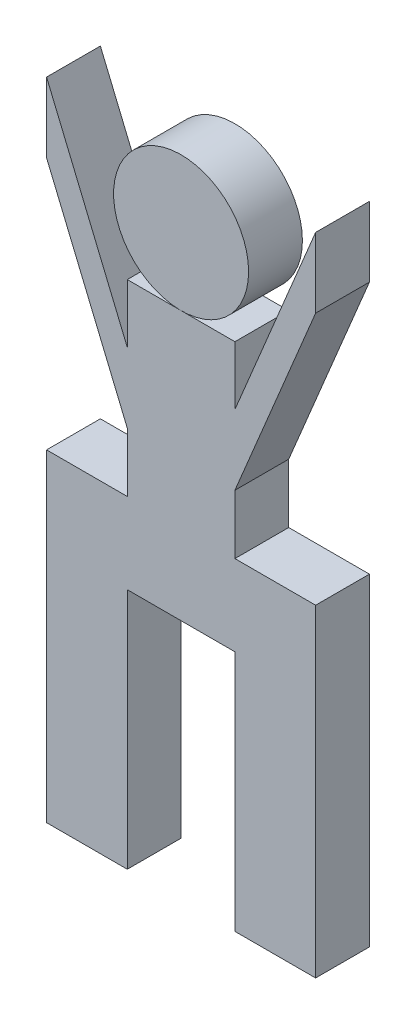
ISO-10303-21;
HEADER;
FILE_DESCRIPTION(('STEP AP214'),'2;1');
FILE_NAME('part.step','',(''),(''),'','','');
FILE_SCHEMA(('AUTOMOTIVE_DESIGN { 1 0 10303 214 1 1 1 1 }'));
ENDSEC;
DATA;
#1=APPLICATION_CONTEXT('core data for automotive mechanical design processes');
#2=APPLICATION_PROTOCOL_DEFINITION('international standard','automotive_design',2000,#1);
#3=PRODUCT_CONTEXT('',#1,'mechanical');
#4=PRODUCT('Part','Part','',(#3));
#5=PRODUCT_RELATED_PRODUCT_CATEGORY('part','',(#4));
#6=PRODUCT_DEFINITION_FORMATION('','',#4);
#7=PRODUCT_DEFINITION_CONTEXT('part definition',#1,'design');
#8=PRODUCT_DEFINITION('design','',#6,#7);
#9=PRODUCT_DEFINITION_SHAPE('','',#8);
#10=(LENGTH_UNIT() NAMED_UNIT(*) SI_UNIT(.MILLI.,.METRE.));
#11=(NAMED_UNIT(*) PLANE_ANGLE_UNIT() SI_UNIT($,.RADIAN.));
#12=(NAMED_UNIT(*) SI_UNIT($,.STERADIAN.) SOLID_ANGLE_UNIT());
#13=UNCERTAINTY_MEASURE_WITH_UNIT(LENGTH_MEASURE(1.E-05),#10,'distance_accuracy_value','');
#14=(GEOMETRIC_REPRESENTATION_CONTEXT(3) GLOBAL_UNCERTAINTY_ASSIGNED_CONTEXT((#13)) GLOBAL_UNIT_ASSIGNED_CONTEXT((#10,
#11,#12)) REPRESENTATION_CONTEXT('',''));
#15=CARTESIAN_POINT('',(0.,0.,0.));
#16=DIRECTION('',(0.,0.,1.));
#17=DIRECTION('',(1.,0.,0.));
#18=AXIS2_PLACEMENT_3D('',#15,#16,#17);
#19=CARTESIAN_POINT('',(4.61538461538456,-1.92307692307691,10.));
#20=DIRECTION('',(0.923076923076923,-0.384615384615385,0.));
#21=DIRECTION('',(0.384615384615386,0.923076923076923,0.));
#22=AXIS2_PLACEMENT_3D('',#19,#20,#21);
#23=PLANE('',#22);
#24=DIRECTION('',(-0.384615384615386,-0.923076923076923,0.));
#25=VECTOR('',#24,1.);
#26=CARTESIAN_POINT('',(4.61538461538456,-1.92307692307691,0.));
#27=LINE('',#26,#25);
#28=CARTESIAN_POINT('',(25.,47.,0.));
#29=VERTEX_POINT('',#28);
#30=CARTESIAN_POINT('',(10.,11.0000000000001,0.));
#31=VERTEX_POINT('',#30);
#32=EDGE_CURVE('E286',#29,#31,#27,.T.);
#33=ORIENTED_EDGE('',*,*,#32,.F.);
#34=DIRECTION('',(0.,0.,-1.));
#35=VECTOR('',#34,1.);
#36=CARTESIAN_POINT('',(25.,47.,10.));
#37=LINE('',#36,#35);
#38=CARTESIAN_POINT('',(25.,47.,10.));
#39=VERTEX_POINT('',#38);
#40=EDGE_CURVE('E13',#39,#29,#37,.T.);
#41=ORIENTED_EDGE('',*,*,#40,.F.);
#42=DIRECTION('',(-0.384615384615386,-0.923076923076923,0.));
#43=VECTOR('',#42,1.);
#44=CARTESIAN_POINT('',(4.61538461538456,-1.92307692307691,10.));
#45=LINE('',#44,#43);
#46=CARTESIAN_POINT('',(10.,11.0000000000001,10.));
#47=VERTEX_POINT('',#46);
#48=EDGE_CURVE('E357',#39,#47,#45,.T.);
#49=ORIENTED_EDGE('',*,*,#48,.T.);
#50=DIRECTION('',(0.,0.,-1.));
#51=VECTOR('',#50,1.);
#52=CARTESIAN_POINT('',(10.,11.0000000000001,10.));
#53=LINE('',#52,#51);
#54=EDGE_CURVE('E203',#47,#31,#53,.T.);
#55=ORIENTED_EDGE('',*,*,#54,.T.);
#56=EDGE_LOOP('',(#33,#41,#49,#55));
#57=FACE_BOUND('',#56,.T.);
#58=ADVANCED_FACE('F116',(#57),#23,.T.);
#59=CARTESIAN_POINT('',(25.0000000000001,0.,10.));
#60=DIRECTION('',(1.,0.,0.));
#61=DIRECTION('',(0.,1.,0.));
#62=AXIS2_PLACEMENT_3D('',#59,#60,#61);
#63=PLANE('',#62);
#64=DIRECTION('',(0.,-1.,0.));
#65=VECTOR('',#64,1.);
#66=CARTESIAN_POINT('',(25.0000000000001,0.,0.));
#67=LINE('',#66,#65);
#68=CARTESIAN_POINT('',(25.,60.,0.));
#69=VERTEX_POINT('',#68);
#70=EDGE_CURVE('E290',#69,#29,#67,.T.);
#71=ORIENTED_EDGE('',*,*,#70,.F.);
#72=DIRECTION('',(0.,0.,-1.));
#73=VECTOR('',#72,1.);
#74=CARTESIAN_POINT('',(25.,60.,10.));
#75=LINE('',#74,#73);
#76=CARTESIAN_POINT('',(25.,60.,10.));
#77=VERTEX_POINT('',#76);
#78=EDGE_CURVE('E125',#77,#69,#75,.T.);
#79=ORIENTED_EDGE('',*,*,#78,.F.);
#80=DIRECTION('',(0.,-1.,0.));
#81=VECTOR('',#80,1.);
#82=CARTESIAN_POINT('',(25.0000000000001,0.,10.));
#83=LINE('',#82,#81);
#84=EDGE_CURVE('E436',#77,#39,#83,.T.);
#85=ORIENTED_EDGE('',*,*,#84,.T.);
#86=ORIENTED_EDGE('',*,*,#40,.T.);
#87=EDGE_LOOP('',(#71,#79,#85,#86));
#88=FACE_BOUND('',#87,.T.);
#89=ADVANCED_FACE('F421',(#88),#63,.T.);
#90=CARTESIAN_POINT('',(0.,0.,10.));
#91=DIRECTION('',(-0.923076923076923,0.384615384615386,0.));
#92=DIRECTION('',(-0.384615384615386,-0.923076923076923,0.));
#93=AXIS2_PLACEMENT_3D('',#90,#91,#92);
#94=PLANE('',#93);
#95=DIRECTION('',(0.384615384615386,0.923076923076923,0.));
#96=VECTOR('',#95,1.);
#97=CARTESIAN_POINT('',(0.,0.,0.));
#98=LINE('',#97,#96);
#99=CARTESIAN_POINT('',(10.,24.0000000000002,0.));
#100=VERTEX_POINT('',#99);
#101=EDGE_CURVE('E294',#100,#69,#98,.T.);
#102=ORIENTED_EDGE('',*,*,#101,.F.);
#103=DIRECTION('',(0.,0.,-1.));
#104=VECTOR('',#103,1.);
#105=CARTESIAN_POINT('',(10.,24.0000000000002,10.));
#106=LINE('',#105,#104);
#107=CARTESIAN_POINT('',(10.,24.0000000000002,10.));
#108=VERTEX_POINT('',#107);
#109=EDGE_CURVE('E408',#108,#100,#106,.T.);
#110=ORIENTED_EDGE('',*,*,#109,.F.);
#111=DIRECTION('',(0.384615384615386,0.923076923076923,0.));
#112=VECTOR('',#111,1.);
#113=CARTESIAN_POINT('',(0.,0.,10.));
#114=LINE('',#113,#112);
#115=EDGE_CURVE('E417',#108,#77,#114,.T.);
#116=ORIENTED_EDGE('',*,*,#115,.T.);
#117=ORIENTED_EDGE('',*,*,#78,.T.);
#118=EDGE_LOOP('',(#102,#110,#116,#117));
#119=FACE_BOUND('',#118,.T.);
#120=ADVANCED_FACE('F415',(#119),#94,.T.);
#121=CARTESIAN_POINT('',(10.0000000000001,0.,10.));
#122=DIRECTION('',(-1.,0.,0.));
#123=DIRECTION('',(0.,-1.,0.));
#124=AXIS2_PLACEMENT_3D('',#121,#122,#123);
#125=PLANE('',#124);
#126=DIRECTION('',(0.,1.,0.));
#127=VECTOR('',#126,1.);
#128=CARTESIAN_POINT('',(10.0000000000001,0.,0.));
#129=LINE('',#128,#127);
#130=CARTESIAN_POINT('',(10.,34.9107304586896,0.));
#131=VERTEX_POINT('',#130);
#132=EDGE_CURVE('E298',#100,#131,#129,.T.);
#133=ORIENTED_EDGE('',*,*,#132,.T.);
#134=DIRECTION('',(0.,0.,-1.));
#135=VECTOR('',#134,1.);
#136=CARTESIAN_POINT('',(10.,34.9107304586896,10.));
#137=LINE('',#136,#135);
#138=CARTESIAN_POINT('',(10.,34.9107304586896,10.));
#139=VERTEX_POINT('',#138);
#140=EDGE_CURVE('E405',#139,#131,#137,.T.);
#141=ORIENTED_EDGE('',*,*,#140,.F.);
#142=DIRECTION('',(0.,1.,0.));
#143=VECTOR('',#142,1.);
#144=CARTESIAN_POINT('',(10.0000000000001,0.,10.));
#145=LINE('',#144,#143);
#146=EDGE_CURVE('E431',#108,#139,#145,.T.);
#147=ORIENTED_EDGE('',*,*,#146,.F.);
#148=ORIENTED_EDGE('',*,*,#109,.T.);
#149=EDGE_LOOP('',(#133,#141,#147,#148));
#150=FACE_BOUND('',#149,.T.);
#151=ADVANCED_FACE('F428',(#150),#125,.F.);
#152=CARTESIAN_POINT('',(0.,34.9107304586896,10.));
#153=DIRECTION('',(0.,1.,0.));
#154=DIRECTION('',(0.,0.,1.));
#155=AXIS2_PLACEMENT_3D('',#152,#153,#154);
#156=PLANE('',#155);
#157=DIRECTION('',(1.,0.,0.));
#158=VECTOR('',#157,1.);
#159=CARTESIAN_POINT('',(0.,34.9107304586896,0.));
#160=LINE('',#159,#158);
#161=CARTESIAN_POINT('',(-10.,34.9107304586896,0.));
#162=VERTEX_POINT('',#161);
#163=EDGE_CURVE('E302',#162,#131,#160,.T.);
#164=ORIENTED_EDGE('',*,*,#163,.F.);
#165=DIRECTION('',(0.,0.,-1.));
#166=VECTOR('',#165,1.);
#167=CARTESIAN_POINT('',(-10.,34.9107304586896,10.));
#168=LINE('',#167,#166);
#169=CARTESIAN_POINT('',(-10.,34.9107304586896,10.));
#170=VERTEX_POINT('',#169);
#171=EDGE_CURVE('E402',#170,#162,#168,.T.);
#172=ORIENTED_EDGE('',*,*,#171,.F.);
#173=DIRECTION('',(1.,0.,0.));
#174=VECTOR('',#173,1.);
#175=CARTESIAN_POINT('',(0.,34.9107304586896,10.));
#176=LINE('',#175,#174);
#177=EDGE_CURVE('E434',#170,#139,#176,.T.);
#178=ORIENTED_EDGE('',*,*,#177,.T.);
#179=ORIENTED_EDGE('',*,*,#140,.T.);
#180=EDGE_LOOP('',(#164,#172,#178,#179));
#181=FACE_BOUND('',#180,.T.);
#182=ADVANCED_FACE('F667',(#181),#156,.T.);
#183=CARTESIAN_POINT('',(-10.0000000000001,0.,10.));
#184=DIRECTION('',(-1.,0.,0.));
#185=DIRECTION('',(0.,-1.,0.));
#186=AXIS2_PLACEMENT_3D('',#183,#184,#185);
#187=PLANE('',#186);
#188=DIRECTION('',(0.,1.,0.));
#189=VECTOR('',#188,1.);
#190=CARTESIAN_POINT('',(-10.0000000000001,0.,0.));
#191=LINE('',#190,#189);
#192=CARTESIAN_POINT('',(-10.,24.0000000000002,0.));
#193=VERTEX_POINT('',#192);
#194=EDGE_CURVE('E306',#193,#162,#191,.T.);
#195=ORIENTED_EDGE('',*,*,#194,.F.);
#196=DIRECTION('',(0.,0.,-1.));
#197=VECTOR('',#196,1.);
#198=CARTESIAN_POINT('',(-10.,24.0000000000002,10.));
#199=LINE('',#198,#197);
#200=CARTESIAN_POINT('',(-10.,24.0000000000002,10.));
#201=VERTEX_POINT('',#200);
#202=EDGE_CURVE('E399',#201,#193,#199,.T.);
#203=ORIENTED_EDGE('',*,*,#202,.F.);
#204=DIRECTION('',(0.,1.,0.));
#205=VECTOR('',#204,1.);
#206=CARTESIAN_POINT('',(-10.0000000000001,0.,10.));
#207=LINE('',#206,#205);
#208=EDGE_CURVE('E445',#201,#170,#207,.T.);
#209=ORIENTED_EDGE('',*,*,#208,.T.);
#210=ORIENTED_EDGE('',*,*,#171,.T.);
#211=EDGE_LOOP('',(#195,#203,#209,#210));
#212=FACE_BOUND('',#211,.T.);
#213=ADVANCED_FACE('F656',(#212),#187,.T.);
#214=CARTESIAN_POINT('',(0.,0.,10.));
#215=DIRECTION('',(-0.923076923076923,-0.384615384615385,0.));
#216=DIRECTION('',(0.384615384615386,-0.923076923076923,0.));
#217=AXIS2_PLACEMENT_3D('',#214,#215,#216);
#218=PLANE('',#217);
#219=DIRECTION('',(-0.384615384615386,0.923076923076923,0.));
#220=VECTOR('',#219,1.);
#221=CARTESIAN_POINT('',(0.,0.,0.));
#222=LINE('',#221,#220);
#223=CARTESIAN_POINT('',(-25.,60.,0.));
#224=VERTEX_POINT('',#223);
#225=EDGE_CURVE('E310',#193,#224,#222,.T.);
#226=ORIENTED_EDGE('',*,*,#225,.T.);
#227=DIRECTION('',(0.,0.,-1.));
#228=VECTOR('',#227,1.);
#229=CARTESIAN_POINT('',(-25.,60.,10.));
#230=LINE('',#229,#228);
#231=CARTESIAN_POINT('',(-25.,60.,10.));
#232=VERTEX_POINT('',#231);
#233=EDGE_CURVE('E395',#232,#224,#230,.T.);
#234=ORIENTED_EDGE('',*,*,#233,.F.);
#235=DIRECTION('',(-0.384615384615386,0.923076923076923,0.));
#236=VECTOR('',#235,1.);
#237=CARTESIAN_POINT('',(0.,0.,10.));
#238=LINE('',#237,#236);
#239=EDGE_CURVE('E449',#201,#232,#238,.T.);
#240=ORIENTED_EDGE('',*,*,#239,.F.);
#241=ORIENTED_EDGE('',*,*,#202,.T.);
#242=EDGE_LOOP('',(#226,#234,#240,#241));
#243=FACE_BOUND('',#242,.T.);
#244=ADVANCED_FACE('F645',(#243),#218,.F.);
#245=CARTESIAN_POINT('',(-25.,0.,10.));
#246=DIRECTION('',(1.,0.,0.));
#247=DIRECTION('',(0.,0.,-1.));
#248=AXIS2_PLACEMENT_3D('',#245,#246,#247);
#249=PLANE('',#248);
#250=DIRECTION('',(0.,-1.,0.));
#251=VECTOR('',#250,1.);
#252=CARTESIAN_POINT('',(-25.,0.,0.));
#253=LINE('',#252,#251);
#254=CARTESIAN_POINT('',(-25.,47.,0.));
#255=VERTEX_POINT('',#254);
#256=EDGE_CURVE('E313',#224,#255,#253,.T.);
#257=ORIENTED_EDGE('',*,*,#256,.T.);
#258=DIRECTION('',(0.,0.,-1.));
#259=VECTOR('',#258,1.);
#260=CARTESIAN_POINT('',(-25.,47.,10.));
#261=LINE('',#260,#259);
#262=CARTESIAN_POINT('',(-25.,47.,10.));
#263=VERTEX_POINT('',#262);
#264=EDGE_CURVE('E391',#263,#255,#261,.T.);
#265=ORIENTED_EDGE('',*,*,#264,.F.);
#266=DIRECTION('',(0.,-1.,0.));
#267=VECTOR('',#266,1.);
#268=CARTESIAN_POINT('',(-25.,0.,10.));
#269=LINE('',#268,#267);
#270=EDGE_CURVE('E452',#232,#263,#269,.T.);
#271=ORIENTED_EDGE('',*,*,#270,.F.);
#272=ORIENTED_EDGE('',*,*,#233,.T.);
#273=EDGE_LOOP('',(#257,#265,#271,#272));
#274=FACE_BOUND('',#273,.T.);
#275=ADVANCED_FACE('F634',(#274),#249,.F.);
#276=CARTESIAN_POINT('',(-4.61538461538456,-1.92307692307691,10.));
#277=DIRECTION('',(0.923076923076923,0.384615384615385,0.));
#278=DIRECTION('',(-0.384615384615386,0.923076923076923,0.));
#279=AXIS2_PLACEMENT_3D('',#276,#277,#278);
#280=PLANE('',#279);
#281=DIRECTION('',(0.384615384615386,-0.923076923076923,0.));
#282=VECTOR('',#281,1.);
#283=CARTESIAN_POINT('',(-4.61538461538456,-1.92307692307691,0.));
#284=LINE('',#283,#282);
#285=CARTESIAN_POINT('',(-10.,11.0000000000001,0.));
#286=VERTEX_POINT('',#285);
#287=EDGE_CURVE('E316',#255,#286,#284,.T.);
#288=ORIENTED_EDGE('',*,*,#287,.T.);
#289=DIRECTION('',(0.,0.,-1.));
#290=VECTOR('',#289,1.);
#291=CARTESIAN_POINT('',(-10.,11.0000000000001,10.));
#292=LINE('',#291,#290);
#293=CARTESIAN_POINT('',(-10.,11.0000000000001,10.));
#294=VERTEX_POINT('',#293);
#295=EDGE_CURVE('E388',#294,#286,#292,.T.);
#296=ORIENTED_EDGE('',*,*,#295,.F.);
#297=DIRECTION('',(0.384615384615386,-0.923076923076923,0.));
#298=VECTOR('',#297,1.);
#299=CARTESIAN_POINT('',(-4.61538461538456,-1.92307692307691,10.));
#300=LINE('',#299,#298);
#301=EDGE_CURVE('E455',#263,#294,#300,.T.);
#302=ORIENTED_EDGE('',*,*,#301,.F.);
#303=ORIENTED_EDGE('',*,*,#264,.T.);
#304=EDGE_LOOP('',(#288,#296,#302,#303));
#305=FACE_BOUND('',#304,.T.);
#306=ADVANCED_FACE('F623',(#305),#280,.F.);
#307=CARTESIAN_POINT('',(-10.,0.,10.));
#308=DIRECTION('',(-1.,0.,0.));
#309=DIRECTION('',(0.,-1.,0.));
#310=AXIS2_PLACEMENT_3D('',#307,#308,#309);
#311=PLANE('',#310);
#312=DIRECTION('',(0.,1.,0.));
#313=VECTOR('',#312,1.);
#314=CARTESIAN_POINT('',(-10.,0.,0.));
#315=LINE('',#314,#313);
#316=CARTESIAN_POINT('',(-10.,0.,0.));
#317=VERTEX_POINT('',#316);
#318=EDGE_CURVE('E320',#317,#286,#315,.T.);
#319=ORIENTED_EDGE('',*,*,#318,.F.);
#320=DIRECTION('',(0.,0.,-1.));
#321=VECTOR('',#320,1.);
#322=CARTESIAN_POINT('',(-10.,0.,10.));
#323=LINE('',#322,#321);
#324=CARTESIAN_POINT('',(-10.,0.,10.));
#325=VERTEX_POINT('',#324);
#326=EDGE_CURVE('E385',#325,#317,#323,.T.);
#327=ORIENTED_EDGE('',*,*,#326,.F.);
#328=DIRECTION('',(0.,1.,0.));
#329=VECTOR('',#328,1.);
#330=CARTESIAN_POINT('',(-10.,0.,10.));
#331=LINE('',#330,#329);
#332=EDGE_CURVE('E458',#325,#294,#331,.T.);
#333=ORIENTED_EDGE('',*,*,#332,.T.);
#334=ORIENTED_EDGE('',*,*,#295,.T.);
#335=EDGE_LOOP('',(#319,#327,#333,#334));
#336=FACE_BOUND('',#335,.T.);
#337=ADVANCED_FACE('F612',(#336),#311,.T.);
#338=CARTESIAN_POINT('',(0.,0.,10.));
#339=DIRECTION('',(0.,1.,0.));
#340=DIRECTION('',(-1.,0.,0.));
#341=AXIS2_PLACEMENT_3D('',#338,#339,#340);
#342=PLANE('',#341);
#343=DIRECTION('',(1.,0.,0.));
#344=VECTOR('',#343,1.);
#345=CARTESIAN_POINT('',(0.,0.,0.));
#346=LINE('',#345,#344);
#347=CARTESIAN_POINT('',(-25.,0.,0.));
#348=VERTEX_POINT('',#347);
#349=EDGE_CURVE('E324',#348,#317,#346,.T.);
#350=ORIENTED_EDGE('',*,*,#349,.F.);
#351=DIRECTION('',(0.,0.,-1.));
#352=VECTOR('',#351,1.);
#353=CARTESIAN_POINT('',(-25.,0.,10.));
#354=LINE('',#353,#352);
#355=CARTESIAN_POINT('',(-25.,0.,10.));
#356=VERTEX_POINT('',#355);
#357=EDGE_CURVE('E382',#356,#348,#354,.T.);
#358=ORIENTED_EDGE('',*,*,#357,.F.);
#359=DIRECTION('',(1.,0.,0.));
#360=VECTOR('',#359,1.);
#361=CARTESIAN_POINT('',(0.,0.,10.));
#362=LINE('',#361,#360);
#363=EDGE_CURVE('E462',#356,#325,#362,.T.);
#364=ORIENTED_EDGE('',*,*,#363,.T.);
#365=ORIENTED_EDGE('',*,*,#326,.T.);
#366=EDGE_LOOP('',(#350,#358,#364,#365));
#367=FACE_BOUND('',#366,.T.);
#368=ADVANCED_FACE('F601',(#367),#342,.T.);
#369=CARTESIAN_POINT('',(-25.,0.,10.));
#370=DIRECTION('',(1.,0.,0.));
#371=DIRECTION('',(0.,1.,0.));
#372=AXIS2_PLACEMENT_3D('',#369,#370,#371);
#373=PLANE('',#372);
#374=DIRECTION('',(0.,-1.,0.));
#375=VECTOR('',#374,1.);
#376=CARTESIAN_POINT('',(-25.,0.,0.));
#377=LINE('',#376,#375);
#378=CARTESIAN_POINT('',(-25.,-60.,0.));
#379=VERTEX_POINT('',#378);
#380=EDGE_CURVE('E328',#348,#379,#377,.T.);
#381=ORIENTED_EDGE('',*,*,#380,.T.);
#382=DIRECTION('',(0.,0.,-1.));
#383=VECTOR('',#382,1.);
#384=CARTESIAN_POINT('',(-25.,-60.,10.));
#385=LINE('',#384,#383);
#386=CARTESIAN_POINT('',(-25.,-60.,10.));
#387=VERTEX_POINT('',#386);
#388=EDGE_CURVE('E378',#387,#379,#385,.T.);
#389=ORIENTED_EDGE('',*,*,#388,.F.);
#390=DIRECTION('',(0.,-1.,0.));
#391=VECTOR('',#390,1.);
#392=CARTESIAN_POINT('',(-25.,0.,10.));
#393=LINE('',#392,#391);
#394=EDGE_CURVE('E466',#356,#387,#393,.T.);
#395=ORIENTED_EDGE('',*,*,#394,.F.);
#396=ORIENTED_EDGE('',*,*,#357,.T.);
#397=EDGE_LOOP('',(#381,#389,#395,#396));
#398=FACE_BOUND('',#397,.T.);
#399=ADVANCED_FACE('F590',(#398),#373,.F.);
#400=CARTESIAN_POINT('',(0.,-60.,10.));
#401=DIRECTION('',(0.,1.,0.));
#402=DIRECTION('',(0.,0.,1.));
#403=AXIS2_PLACEMENT_3D('',#400,#401,#402);
#404=PLANE('',#403);
#405=DIRECTION('',(1.,0.,0.));
#406=VECTOR('',#405,1.);
#407=CARTESIAN_POINT('',(0.,-60.,0.));
#408=LINE('',#407,#406);
#409=CARTESIAN_POINT('',(-10.,-60.,0.));
#410=VERTEX_POINT('',#409);
#411=EDGE_CURVE('E331',#379,#410,#408,.T.);
#412=ORIENTED_EDGE('',*,*,#411,.T.);
#413=DIRECTION('',(0.,0.,-1.));
#414=VECTOR('',#413,1.);
#415=CARTESIAN_POINT('',(-10.,-60.,10.));
#416=LINE('',#415,#414);
#417=CARTESIAN_POINT('',(-10.,-60.,10.));
#418=VERTEX_POINT('',#417);
#419=EDGE_CURVE('E374',#418,#410,#416,.T.);
#420=ORIENTED_EDGE('',*,*,#419,.F.);
#421=DIRECTION('',(1.,0.,0.));
#422=VECTOR('',#421,1.);
#423=CARTESIAN_POINT('',(0.,-60.,10.));
#424=LINE('',#423,#422);
#425=EDGE_CURVE('E469',#387,#418,#424,.T.);
#426=ORIENTED_EDGE('',*,*,#425,.F.);
#427=ORIENTED_EDGE('',*,*,#388,.T.);
#428=EDGE_LOOP('',(#412,#420,#426,#427));
#429=FACE_BOUND('',#428,.T.);
#430=ADVANCED_FACE('F579',(#429),#404,.F.);
#431=CARTESIAN_POINT('',(-10.,0.,10.));
#432=DIRECTION('',(-1.,0.,0.));
#433=DIRECTION('',(0.,0.,1.));
#434=AXIS2_PLACEMENT_3D('',#431,#432,#433);
#435=PLANE('',#434);
#436=DIRECTION('',(0.,1.,0.));
#437=VECTOR('',#436,1.);
#438=CARTESIAN_POINT('',(-10.,0.,0.));
#439=LINE('',#438,#437);
#440=CARTESIAN_POINT('',(-10.,-15.,0.));
#441=VERTEX_POINT('',#440);
#442=EDGE_CURVE('E334',#410,#441,#439,.T.);
#443=ORIENTED_EDGE('',*,*,#442,.T.);
#444=DIRECTION('',(0.,0.,-1.));
#445=VECTOR('',#444,1.);
#446=CARTESIAN_POINT('',(-10.,-15.,10.));
#447=LINE('',#446,#445);
#448=CARTESIAN_POINT('',(-10.,-15.,10.));
#449=VERTEX_POINT('',#448);
#450=EDGE_CURVE('E370',#449,#441,#447,.T.);
#451=ORIENTED_EDGE('',*,*,#450,.F.);
#452=DIRECTION('',(0.,1.,0.));
#453=VECTOR('',#452,1.);
#454=CARTESIAN_POINT('',(-10.,0.,10.));
#455=LINE('',#454,#453);
#456=EDGE_CURVE('E472',#418,#449,#455,.T.);
#457=ORIENTED_EDGE('',*,*,#456,.F.);
#458=ORIENTED_EDGE('',*,*,#419,.T.);
#459=EDGE_LOOP('',(#443,#451,#457,#458));
#460=FACE_BOUND('',#459,.T.);
#461=ADVANCED_FACE('F569',(#460),#435,.F.);
#462=CARTESIAN_POINT('',(0.,-15.,10.));
#463=DIRECTION('',(0.,1.,0.));
#464=DIRECTION('',(-1.,0.,0.));
#465=AXIS2_PLACEMENT_3D('',#462,#463,#464);
#466=PLANE('',#465);
#467=DIRECTION('',(1.,0.,0.));
#468=VECTOR('',#467,1.);
#469=CARTESIAN_POINT('',(0.,-15.,0.));
#470=LINE('',#469,#468);
#471=CARTESIAN_POINT('',(10.,-15.,0.));
#472=VERTEX_POINT('',#471);
#473=EDGE_CURVE('E337',#441,#472,#470,.T.);
#474=ORIENTED_EDGE('',*,*,#473,.T.);
#475=DIRECTION('',(0.,0.,-1.));
#476=VECTOR('',#475,1.);
#477=CARTESIAN_POINT('',(10.,-15.,10.));
#478=LINE('',#477,#476);
#479=CARTESIAN_POINT('',(10.,-15.,10.));
#480=VERTEX_POINT('',#479);
#481=EDGE_CURVE('E367',#480,#472,#478,.T.);
#482=ORIENTED_EDGE('',*,*,#481,.F.);
#483=DIRECTION('',(1.,0.,0.));
#484=VECTOR('',#483,1.);
#485=CARTESIAN_POINT('',(0.,-15.,10.));
#486=LINE('',#485,#484);
#487=EDGE_CURVE('E475',#449,#480,#486,.T.);
#488=ORIENTED_EDGE('',*,*,#487,.F.);
#489=ORIENTED_EDGE('',*,*,#450,.T.);
#490=EDGE_LOOP('',(#474,#482,#488,#489));
#491=FACE_BOUND('',#490,.T.);
#492=ADVANCED_FACE('F490',(#491),#466,.F.);
#493=CARTESIAN_POINT('',(10.,0.,10.));
#494=DIRECTION('',(-1.,0.,0.));
#495=DIRECTION('',(0.,-1.,0.));
#496=AXIS2_PLACEMENT_3D('',#493,#494,#495);
#497=PLANE('',#496);
#498=DIRECTION('',(0.,1.,0.));
#499=VECTOR('',#498,1.);
#500=CARTESIAN_POINT('',(10.,0.,0.));
#501=LINE('',#500,#499);
#502=CARTESIAN_POINT('',(10.,-60.,0.));
#503=VERTEX_POINT('',#502);
#504=EDGE_CURVE('E341',#503,#472,#501,.T.);
#505=ORIENTED_EDGE('',*,*,#504,.F.);
#506=DIRECTION('',(0.,0.,-1.));
#507=VECTOR('',#506,1.);
#508=CARTESIAN_POINT('',(10.,-60.,10.));
#509=LINE('',#508,#507);
#510=CARTESIAN_POINT('',(10.,-60.,10.));
#511=VERTEX_POINT('',#510);
#512=EDGE_CURVE('E364',#511,#503,#509,.T.);
#513=ORIENTED_EDGE('',*,*,#512,.F.);
#514=DIRECTION('',(0.,1.,0.));
#515=VECTOR('',#514,1.);
#516=CARTESIAN_POINT('',(10.,0.,10.));
#517=LINE('',#516,#515);
#518=EDGE_CURVE('E478',#511,#480,#517,.T.);
#519=ORIENTED_EDGE('',*,*,#518,.T.);
#520=ORIENTED_EDGE('',*,*,#481,.T.);
#521=EDGE_LOOP('',(#505,#513,#519,#520));
#522=FACE_BOUND('',#521,.T.);
#523=ADVANCED_FACE('F484',(#522),#497,.T.);
#524=CARTESIAN_POINT('',(0.,-60.,10.));
#525=DIRECTION('',(0.,1.,0.));
#526=DIRECTION('',(0.,0.,1.));
#527=AXIS2_PLACEMENT_3D('',#524,#525,#526);
#528=PLANE('',#527);
#529=DIRECTION('',(1.,0.,0.));
#530=VECTOR('',#529,1.);
#531=CARTESIAN_POINT('',(0.,-60.,0.));
#532=LINE('',#531,#530);
#533=CARTESIAN_POINT('',(25.,-60.,0.));
#534=VERTEX_POINT('',#533);
#535=EDGE_CURVE('E345',#503,#534,#532,.T.);
#536=ORIENTED_EDGE('',*,*,#535,.T.);
#537=DIRECTION('',(0.,0.,-1.));
#538=VECTOR('',#537,1.);
#539=CARTESIAN_POINT('',(25.,-60.,10.));
#540=LINE('',#539,#538);
#541=CARTESIAN_POINT('',(25.,-60.,10.));
#542=VERTEX_POINT('',#541);
#543=EDGE_CURVE('E269',#542,#534,#540,.T.);
#544=ORIENTED_EDGE('',*,*,#543,.F.);
#545=DIRECTION('',(1.,0.,0.));
#546=VECTOR('',#545,1.);
#547=CARTESIAN_POINT('',(0.,-60.,10.));
#548=LINE('',#547,#546);
#549=EDGE_CURVE('E275',#511,#542,#548,.T.);
#550=ORIENTED_EDGE('',*,*,#549,.F.);
#551=ORIENTED_EDGE('',*,*,#512,.T.);
#552=EDGE_LOOP('',(#536,#544,#550,#551));
#553=FACE_BOUND('',#552,.T.);
#554=ADVANCED_FACE('F495',(#553),#528,.F.);
#555=CARTESIAN_POINT('',(25.,0.,10.));
#556=DIRECTION('',(1.,0.,0.));
#557=DIRECTION('',(0.,1.,0.));
#558=AXIS2_PLACEMENT_3D('',#555,#556,#557);
#559=PLANE('',#558);
#560=DIRECTION('',(0.,-1.,0.));
#561=VECTOR('',#560,1.);
#562=CARTESIAN_POINT('',(25.,0.,0.));
#563=LINE('',#562,#561);
#564=CARTESIAN_POINT('',(25.,0.,0.));
#565=VERTEX_POINT('',#564);
#566=EDGE_CURVE('E263',#565,#534,#563,.T.);
#567=ORIENTED_EDGE('',*,*,#566,.F.);
#568=DIRECTION('',(0.,0.,-1.));
#569=VECTOR('',#568,1.);
#570=CARTESIAN_POINT('',(25.,0.,10.));
#571=LINE('',#570,#569);
#572=CARTESIAN_POINT('',(25.,0.,10.));
#573=VERTEX_POINT('',#572);
#574=EDGE_CURVE('E258',#573,#565,#571,.T.);
#575=ORIENTED_EDGE('',*,*,#574,.F.);
#576=DIRECTION('',(0.,-1.,0.));
#577=VECTOR('',#576,1.);
#578=CARTESIAN_POINT('',(25.,0.,10.));
#579=LINE('',#578,#577);
#580=EDGE_CURVE('E261',#573,#542,#579,.T.);
#581=ORIENTED_EDGE('',*,*,#580,.T.);
#582=ORIENTED_EDGE('',*,*,#543,.T.);
#583=EDGE_LOOP('',(#567,#575,#581,#582));
#584=FACE_BOUND('',#583,.T.);
#585=ADVANCED_FACE('F260',(#584),#559,.T.);
#586=CARTESIAN_POINT('',(0.,0.,10.));
#587=DIRECTION('',(0.,1.,0.));
#588=DIRECTION('',(-1.,0.,0.));
#589=AXIS2_PLACEMENT_3D('',#586,#587,#588);
#590=PLANE('',#589);
#591=DIRECTION('',(1.,0.,0.));
#592=VECTOR('',#591,1.);
#593=CARTESIAN_POINT('',(0.,0.,0.));
#594=LINE('',#593,#592);
#595=CARTESIAN_POINT('',(10.,0.,0.));
#596=VERTEX_POINT('',#595);
#597=EDGE_CURVE('E351',#596,#565,#594,.T.);
#598=ORIENTED_EDGE('',*,*,#597,.F.);
#599=DIRECTION('',(0.,0.,-1.));
#600=VECTOR('',#599,1.);
#601=CARTESIAN_POINT('',(10.,0.,10.));
#602=LINE('',#601,#600);
#603=CARTESIAN_POINT('',(10.,0.,10.));
#604=VERTEX_POINT('',#603);
#605=EDGE_CURVE('E196',#604,#596,#602,.T.);
#606=ORIENTED_EDGE('',*,*,#605,.F.);
#607=DIRECTION('',(1.,0.,0.));
#608=VECTOR('',#607,1.);
#609=CARTESIAN_POINT('',(0.,0.,10.));
#610=LINE('',#609,#608);
#611=EDGE_CURVE('E272',#604,#573,#610,.T.);
#612=ORIENTED_EDGE('',*,*,#611,.T.);
#613=ORIENTED_EDGE('',*,*,#574,.T.);
#614=EDGE_LOOP('',(#598,#606,#612,#613));
#615=FACE_BOUND('',#614,.T.);
#616=ADVANCED_FACE('F279',(#615),#590,.T.);
#617=CARTESIAN_POINT('',(10.,0.,10.));
#618=DIRECTION('',(-1.,0.,0.));
#619=DIRECTION('',(0.,-1.,0.));
#620=AXIS2_PLACEMENT_3D('',#617,#618,#619);
#621=PLANE('',#620);
#622=DIRECTION('',(0.,1.,0.));
#623=VECTOR('',#622,1.);
#624=CARTESIAN_POINT('',(10.,0.,0.));
#625=LINE('',#624,#623);
#626=EDGE_CURVE('E354',#596,#31,#625,.T.);
#627=ORIENTED_EDGE('',*,*,#626,.T.);
#628=ORIENTED_EDGE('',*,*,#54,.F.);
#629=DIRECTION('',(0.,1.,0.));
#630=VECTOR('',#629,1.);
#631=CARTESIAN_POINT('',(10.,0.,10.));
#632=LINE('',#631,#630);
#633=EDGE_CURVE('E133',#604,#47,#632,.T.);
#634=ORIENTED_EDGE('',*,*,#633,.F.);
#635=ORIENTED_EDGE('',*,*,#605,.T.);
#636=EDGE_LOOP('',(#627,#628,#634,#635));
#637=FACE_BOUND('',#636,.T.);
#638=ADVANCED_FACE('F508',(#637),#621,.F.);
#639=CARTESIAN_POINT('',(0.,0.,10.));
#640=DIRECTION('',(0.,0.,1.));
#641=DIRECTION('',(1.,0.,0.));
#642=AXIS2_PLACEMENT_3D('',#639,#640,#641);
#643=PLANE('',#642);
#644=ORIENTED_EDGE('',*,*,#48,.F.);
#645=ORIENTED_EDGE('',*,*,#84,.F.);
#646=ORIENTED_EDGE('',*,*,#115,.F.);
#647=ORIENTED_EDGE('',*,*,#146,.T.);
#648=ORIENTED_EDGE('',*,*,#177,.F.);
#649=ORIENTED_EDGE('',*,*,#208,.F.);
#650=ORIENTED_EDGE('',*,*,#239,.T.);
#651=ORIENTED_EDGE('',*,*,#270,.T.);
#652=ORIENTED_EDGE('',*,*,#301,.T.);
#653=ORIENTED_EDGE('',*,*,#332,.F.);
#654=ORIENTED_EDGE('',*,*,#363,.F.);
#655=ORIENTED_EDGE('',*,*,#394,.T.);
#656=ORIENTED_EDGE('',*,*,#425,.T.);
#657=ORIENTED_EDGE('',*,*,#456,.T.);
#658=ORIENTED_EDGE('',*,*,#487,.T.);
#659=ORIENTED_EDGE('',*,*,#518,.F.);
#660=ORIENTED_EDGE('',*,*,#549,.T.);
#661=ORIENTED_EDGE('',*,*,#580,.F.);
#662=ORIENTED_EDGE('',*,*,#611,.F.);
#663=ORIENTED_EDGE('',*,*,#633,.T.);
#664=EDGE_LOOP('',(#644,#645,#646,#647,#648,#649,#650,#651,#652,#653,#654,#655,#656,#657,#658,
#659,#660,#661,#662,#663));
#665=FACE_BOUND('',#664,.T.);
#666=ADVANCED_FACE('F271',(#665),#643,.T.);
#667=CARTESIAN_POINT('',(0.,0.,0.));
#668=DIRECTION('',(0.,0.,1.));
#669=DIRECTION('',(1.,0.,0.));
#670=AXIS2_PLACEMENT_3D('',#667,#668,#669);
#671=PLANE('',#670);
#672=ORIENTED_EDGE('',*,*,#32,.T.);
#673=ORIENTED_EDGE('',*,*,#626,.F.);
#674=ORIENTED_EDGE('',*,*,#597,.T.);
#675=ORIENTED_EDGE('',*,*,#566,.T.);
#676=ORIENTED_EDGE('',*,*,#535,.F.);
#677=ORIENTED_EDGE('',*,*,#504,.T.);
#678=ORIENTED_EDGE('',*,*,#473,.F.);
#679=ORIENTED_EDGE('',*,*,#442,.F.);
#680=ORIENTED_EDGE('',*,*,#411,.F.);
#681=ORIENTED_EDGE('',*,*,#380,.F.);
#682=ORIENTED_EDGE('',*,*,#349,.T.);
#683=ORIENTED_EDGE('',*,*,#318,.T.);
#684=ORIENTED_EDGE('',*,*,#287,.F.);
#685=ORIENTED_EDGE('',*,*,#256,.F.);
#686=ORIENTED_EDGE('',*,*,#225,.F.);
#687=ORIENTED_EDGE('',*,*,#194,.T.);
#688=ORIENTED_EDGE('',*,*,#163,.T.);
#689=ORIENTED_EDGE('',*,*,#132,.F.);
#690=ORIENTED_EDGE('',*,*,#101,.T.);
#691=ORIENTED_EDGE('',*,*,#70,.T.);
#692=EDGE_LOOP('',(#672,#673,#674,#675,#676,#677,#678,#679,#680,#681,#682,#683,#684,#685,#686,
#687,#688,#689,#690,#691));
#693=FACE_BOUND('',#692,.T.);
#694=ADVANCED_FACE('F424',(#693),#671,.F.);
#695=CLOSED_SHELL('',(#58,#89,#120,#151,#182,#213,#244,#275,#306,#337,#368,#399,#430,#461,#492,
#523,#554,#585,#616,#638,#666,#694));
#696=MANIFOLD_SOLID_BREP('B2',#695);
#697=CARTESIAN_POINT('',(0.,47.4553652293448,10.));
#698=DIRECTION('',(0.,0.,-1.));
#699=DIRECTION('',(-1.,0.,0.));
#700=AXIS2_PLACEMENT_3D('',#697,#698,#699);
#701=CYLINDRICAL_SURFACE('',#700,12.5446347706552);
#702=CARTESIAN_POINT('',(0.,47.4553652293448,10.));
#703=DIRECTION('',(0.,0.,1.));
#704=DIRECTION('',(1.,0.,0.));
#705=AXIS2_PLACEMENT_3D('',#702,#703,#704);
#706=CIRCLE('',#705,12.5446347706552);
#707=CARTESIAN_POINT('',(12.5446347706552,47.4553652293448,10.));
#708=VERTEX_POINT('',#707);
#709=EDGE_CURVE('E115',#708,#708,#706,.T.);
#710=ORIENTED_EDGE('',*,*,#709,.F.);
#711=EDGE_LOOP('',(#710));
#712=FACE_BOUND('',#711,.T.);
#713=CARTESIAN_POINT('',(0.,47.4553652293448,0.));
#714=DIRECTION('',(0.,0.,1.));
#715=DIRECTION('',(1.,0.,0.));
#716=AXIS2_PLACEMENT_3D('',#713,#714,#715);
#717=CIRCLE('',#716,12.5446347706552);
#718=CARTESIAN_POINT('',(12.5446347706552,47.4553652293448,0.));
#719=VERTEX_POINT('',#718);
#720=EDGE_CURVE('E787',#719,#719,#717,.T.);
#721=ORIENTED_EDGE('',*,*,#720,.T.);
#722=EDGE_LOOP('',(#721));
#723=FACE_BOUND('',#722,.T.);
#724=ADVANCED_FACE('F784',(#712,#723),#701,.T.);
#725=CARTESIAN_POINT('',(0.,0.,10.));
#726=DIRECTION('',(0.,0.,1.));
#727=DIRECTION('',(1.,0.,0.));
#728=AXIS2_PLACEMENT_3D('',#725,#726,#727);
#729=PLANE('',#728);
#730=ORIENTED_EDGE('',*,*,#709,.T.);
#731=EDGE_LOOP('',(#730));
#732=FACE_BOUND('',#731,.T.);
#733=ADVANCED_FACE('F799',(#732),#729,.T.);
#734=CARTESIAN_POINT('',(0.,0.,0.));
#735=DIRECTION('',(0.,0.,1.));
#736=DIRECTION('',(1.,0.,0.));
#737=AXIS2_PLACEMENT_3D('',#734,#735,#736);
#738=PLANE('',#737);
#739=ORIENTED_EDGE('',*,*,#720,.F.);
#740=EDGE_LOOP('',(#739));
#741=FACE_BOUND('',#740,.T.);
#742=ADVANCED_FACE('F797',(#741),#738,.F.);
#743=CLOSED_SHELL('',(#724,#733,#742));
#744=MANIFOLD_SOLID_BREP('B7',#743);
#745=ADVANCED_BREP_SHAPE_REPRESENTATION('',(#18,#696,#744),#14);
#746=SHAPE_DEFINITION_REPRESENTATION(#9,#745);
ENDSEC;
END-ISO-10303-21;
